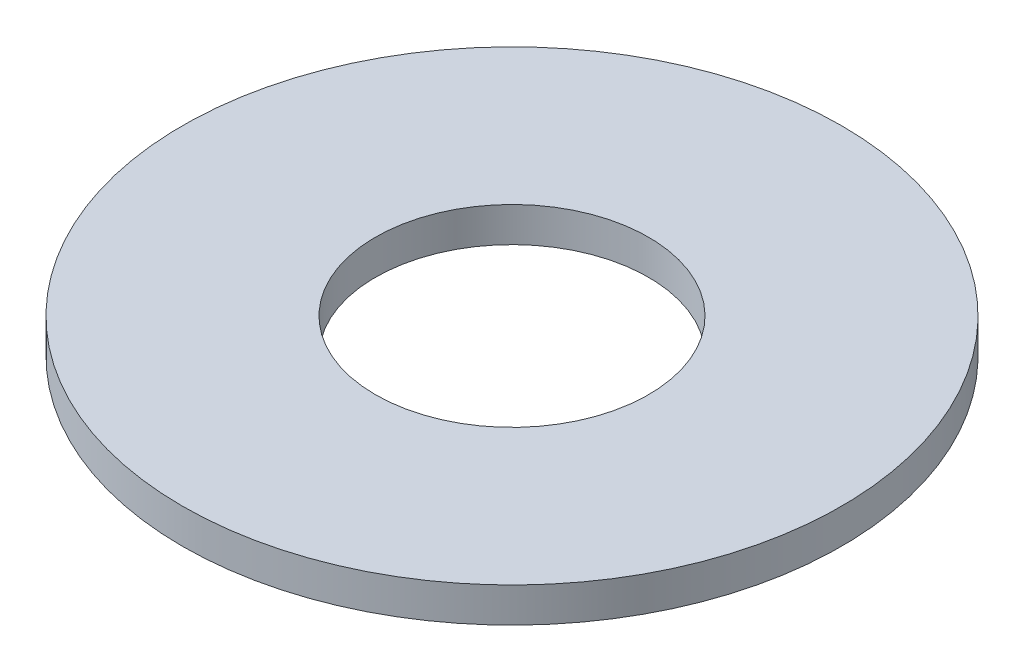
ISO-10303-21;
HEADER;
FILE_DESCRIPTION(('STEP AP214'),'2;1');
FILE_NAME('part.step','',(''),(''),'','','');
FILE_SCHEMA(('AUTOMOTIVE_DESIGN { 1 0 10303 214 1 1 1 1 }'));
ENDSEC;
DATA;
#1=APPLICATION_CONTEXT('core data for automotive mechanical design processes');
#2=APPLICATION_PROTOCOL_DEFINITION('international standard','automotive_design',2000,#1);
#3=PRODUCT_CONTEXT('',#1,'mechanical');
#4=PRODUCT('Part','Part','',(#3));
#5=PRODUCT_RELATED_PRODUCT_CATEGORY('part','',(#4));
#6=PRODUCT_DEFINITION_FORMATION('','',#4);
#7=PRODUCT_DEFINITION_CONTEXT('part definition',#1,'design');
#8=PRODUCT_DEFINITION('design','',#6,#7);
#9=PRODUCT_DEFINITION_SHAPE('','',#8);
#10=(LENGTH_UNIT() NAMED_UNIT(*) SI_UNIT(.MILLI.,.METRE.));
#11=(NAMED_UNIT(*) PLANE_ANGLE_UNIT() SI_UNIT($,.RADIAN.));
#12=(NAMED_UNIT(*) SI_UNIT($,.STERADIAN.) SOLID_ANGLE_UNIT());
#13=UNCERTAINTY_MEASURE_WITH_UNIT(LENGTH_MEASURE(1.E-05),#10,'distance_accuracy_value','');
#14=(GEOMETRIC_REPRESENTATION_CONTEXT(3) GLOBAL_UNCERTAINTY_ASSIGNED_CONTEXT((#13)) GLOBAL_UNIT_ASSIGNED_CONTEXT((#10,
#11,#12)) REPRESENTATION_CONTEXT('',''));
#15=CARTESIAN_POINT('',(0.,0.,0.));
#16=DIRECTION('',(0.,0.,1.));
#17=DIRECTION('',(1.,0.,0.));
#18=AXIS2_PLACEMENT_3D('',#15,#16,#17);
#19=CARTESIAN_POINT('',(0.,4.,0.));
#20=DIRECTION('',(0.,1.,0.));
#21=DIRECTION('',(0.,0.,1.));
#22=AXIS2_PLACEMENT_3D('',#19,#20,#21);
#23=PLANE('',#22);
#24=CARTESIAN_POINT('',(0.,4.,0.));
#25=DIRECTION('',(0.,1.,0.));
#26=DIRECTION('',(0.,0.,1.));
#27=AXIS2_PLACEMENT_3D('',#24,#25,#26);
#28=CIRCLE('',#27,37.9);
#29=CARTESIAN_POINT('',(0.,4.,37.9));
#30=VERTEX_POINT('',#29);
#31=EDGE_CURVE('E10',#30,#30,#28,.T.);
#32=ORIENTED_EDGE('',*,*,#31,.T.);
#33=EDGE_LOOP('',(#32));
#34=FACE_BOUND('',#33,.T.);
#35=CARTESIAN_POINT('',(0.,4.,0.));
#36=DIRECTION('',(0.,1.,0.));
#37=DIRECTION('',(0.,0.,1.));
#38=AXIS2_PLACEMENT_3D('',#35,#36,#37);
#39=CIRCLE('',#38,15.7);
#40=CARTESIAN_POINT('',(0.,4.,15.7));
#41=VERTEX_POINT('',#40);
#42=EDGE_CURVE('E44',#41,#41,#39,.T.);
#43=ORIENTED_EDGE('',*,*,#42,.F.);
#44=EDGE_LOOP('',(#43));
#45=FACE_BOUND('',#44,.T.);
#46=ADVANCED_FACE('F33',(#34,#45),#23,.T.);
#47=CARTESIAN_POINT('',(0.,0.,0.));
#48=DIRECTION('',(0.,1.,0.));
#49=DIRECTION('',(0.,0.,1.));
#50=AXIS2_PLACEMENT_3D('',#47,#48,#49);
#51=PLANE('',#50);
#52=CARTESIAN_POINT('',(0.,0.,0.));
#53=DIRECTION('',(0.,1.,0.));
#54=DIRECTION('',(0.,0.,1.));
#55=AXIS2_PLACEMENT_3D('',#52,#53,#54);
#56=CIRCLE('',#55,37.9);
#57=CARTESIAN_POINT('',(0.,0.,37.9));
#58=VERTEX_POINT('',#57);
#59=EDGE_CURVE('E37',#58,#58,#56,.T.);
#60=ORIENTED_EDGE('',*,*,#59,.F.);
#61=EDGE_LOOP('',(#60));
#62=FACE_BOUND('',#61,.T.);
#63=CARTESIAN_POINT('',(0.,0.,0.));
#64=DIRECTION('',(0.,1.,0.));
#65=DIRECTION('',(0.,0.,1.));
#66=AXIS2_PLACEMENT_3D('',#63,#64,#65);
#67=CIRCLE('',#66,15.7);
#68=CARTESIAN_POINT('',(0.,0.,15.7));
#69=VERTEX_POINT('',#68);
#70=EDGE_CURVE('E46',#69,#69,#67,.T.);
#71=ORIENTED_EDGE('',*,*,#70,.T.);
#72=EDGE_LOOP('',(#71));
#73=FACE_BOUND('',#72,.T.);
#74=ADVANCED_FACE('F56',(#62,#73),#51,.F.);
#75=CARTESIAN_POINT('',(0.,4.,0.));
#76=DIRECTION('',(0.,-1.,0.));
#77=DIRECTION('',(0.,0.,-1.));
#78=AXIS2_PLACEMENT_3D('',#75,#76,#77);
#79=CYLINDRICAL_SURFACE('',#78,37.9);
#80=ORIENTED_EDGE('',*,*,#31,.F.);
#81=EDGE_LOOP('',(#80));
#82=FACE_BOUND('',#81,.T.);
#83=ORIENTED_EDGE('',*,*,#59,.T.);
#84=EDGE_LOOP('',(#83));
#85=FACE_BOUND('',#84,.T.);
#86=ADVANCED_FACE('F35',(#82,#85),#79,.T.);
#87=CARTESIAN_POINT('',(0.,4.,0.));
#88=DIRECTION('',(0.,-1.,0.));
#89=DIRECTION('',(0.,0.,-1.));
#90=AXIS2_PLACEMENT_3D('',#87,#88,#89);
#91=CYLINDRICAL_SURFACE('',#90,15.7);
#92=ORIENTED_EDGE('',*,*,#42,.T.);
#93=EDGE_LOOP('',(#92));
#94=FACE_BOUND('',#93,.T.);
#95=ORIENTED_EDGE('',*,*,#70,.F.);
#96=EDGE_LOOP('',(#95));
#97=FACE_BOUND('',#96,.T.);
#98=ADVANCED_FACE('F52',(#94,#97),#91,.F.);
#99=CLOSED_SHELL('',(#46,#74,#86,#98));
#100=MANIFOLD_SOLID_BREP('B2',#99);
#101=ADVANCED_BREP_SHAPE_REPRESENTATION('',(#18,#100),#14);
#102=SHAPE_DEFINITION_REPRESENTATION(#9,#101);
ENDSEC;
END-ISO-10303-21;
